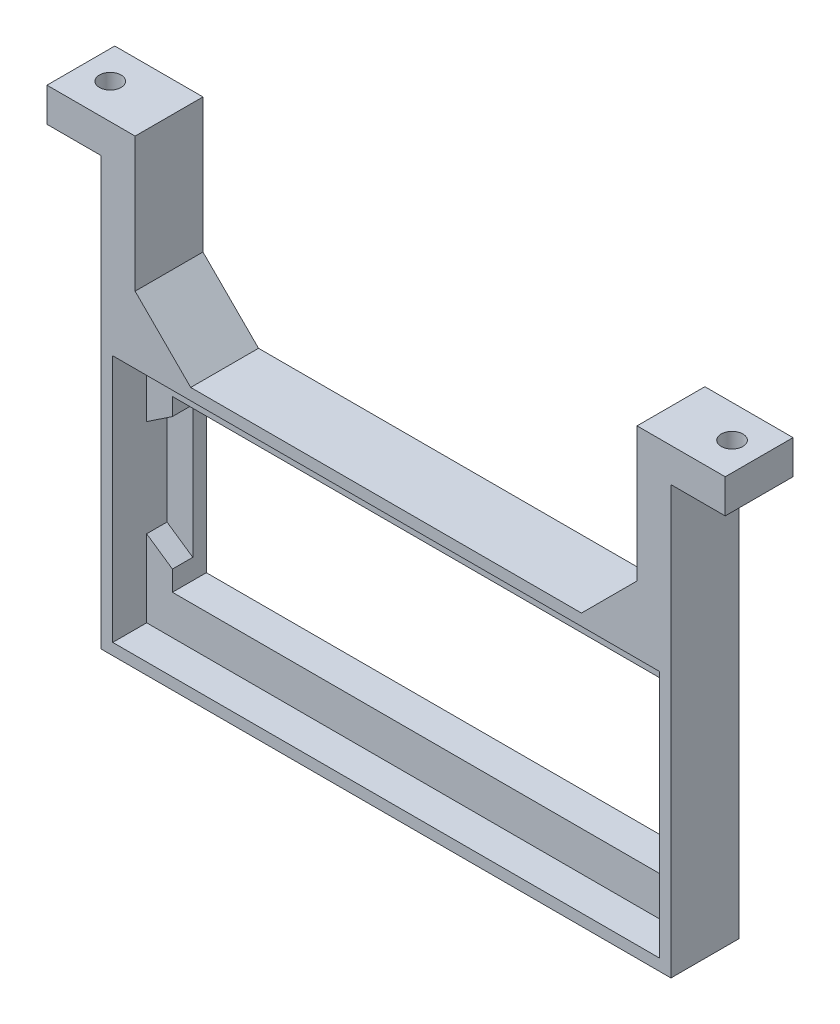
ISO-10303-21;
HEADER;
FILE_DESCRIPTION(('STEP AP214'),'2;1');
FILE_NAME('part.step','',(''),(''),'','','');
FILE_SCHEMA(('AUTOMOTIVE_DESIGN { 1 0 10303 214 1 1 1 1 }'));
ENDSEC;
DATA;
#1=APPLICATION_CONTEXT('core data for automotive mechanical design processes');
#2=APPLICATION_PROTOCOL_DEFINITION('international standard','automotive_design',2000,#1);
#3=PRODUCT_CONTEXT('',#1,'mechanical');
#4=PRODUCT('Part','Part','',(#3));
#5=PRODUCT_RELATED_PRODUCT_CATEGORY('part','',(#4));
#6=PRODUCT_DEFINITION_FORMATION('','',#4);
#7=PRODUCT_DEFINITION_CONTEXT('part definition',#1,'design');
#8=PRODUCT_DEFINITION('design','',#6,#7);
#9=PRODUCT_DEFINITION_SHAPE('','',#8);
#10=(LENGTH_UNIT() NAMED_UNIT(*) SI_UNIT(.MILLI.,.METRE.));
#11=(NAMED_UNIT(*) PLANE_ANGLE_UNIT() SI_UNIT($,.RADIAN.));
#12=(NAMED_UNIT(*) SI_UNIT($,.STERADIAN.) SOLID_ANGLE_UNIT());
#13=UNCERTAINTY_MEASURE_WITH_UNIT(LENGTH_MEASURE(1.E-05),#10,'distance_accuracy_value','');
#14=(GEOMETRIC_REPRESENTATION_CONTEXT(3) GLOBAL_UNCERTAINTY_ASSIGNED_CONTEXT((#13)) GLOBAL_UNIT_ASSIGNED_CONTEXT((#10,
#11,#12)) REPRESENTATION_CONTEXT('',''));
#15=CARTESIAN_POINT('',(0.,0.,0.));
#16=DIRECTION('',(0.,0.,1.));
#17=DIRECTION('',(1.,0.,0.));
#18=AXIS2_PLACEMENT_3D('',#15,#16,#17);
#19=CARTESIAN_POINT('',(0.,0.,5.));
#20=DIRECTION('',(0.,0.,1.));
#21=DIRECTION('',(1.,0.,0.));
#22=AXIS2_PLACEMENT_3D('',#19,#20,#21);
#23=PLANE('',#22);
#24=DIRECTION('',(0.824921634455723,-0.56524711145383,0.));
#25=VECTOR('',#24,1.);
#26=CARTESIAN_POINT('',(1.69999999999999,13.0683034309097,5.));
#27=LINE('',#26,#25);
#28=CARTESIAN_POINT('',(1.69999999999999,13.0683034309097,5.));
#29=VERTEX_POINT('',#28);
#30=CARTESIAN_POINT('',(5.49999999999999,10.4644936460666,5.));
#31=VERTEX_POINT('',#30);
#32=EDGE_CURVE('E257',#29,#31,#27,.T.);
#33=ORIENTED_EDGE('',*,*,#32,.F.);
#34=DIRECTION('',(0.,-1.,0.));
#35=VECTOR('',#34,1.);
#36=CARTESIAN_POINT('',(1.7,38.3,5.));
#37=LINE('',#36,#35);
#38=CARTESIAN_POINT('',(1.7,1.7,5.));
#39=VERTEX_POINT('',#38);
#40=EDGE_CURVE('E316',#29,#39,#37,.T.);
#41=ORIENTED_EDGE('',*,*,#40,.T.);
#42=DIRECTION('',(1.,0.,0.));
#43=VECTOR('',#42,1.);
#44=CARTESIAN_POINT('',(1.7,1.7,5.));
#45=LINE('',#44,#43);
#46=CARTESIAN_POINT('',(82.3,1.7,5.));
#47=VERTEX_POINT('',#46);
#48=EDGE_CURVE('E315',#39,#47,#45,.T.);
#49=ORIENTED_EDGE('',*,*,#48,.T.);
#50=DIRECTION('',(0.,1.,0.));
#51=VECTOR('',#50,1.);
#52=CARTESIAN_POINT('',(82.3,38.3,5.));
#53=LINE('',#52,#51);
#54=CARTESIAN_POINT('',(82.3,13.0683034309097,5.));
#55=VERTEX_POINT('',#54);
#56=EDGE_CURVE('E320',#47,#55,#53,.T.);
#57=ORIENTED_EDGE('',*,*,#56,.T.);
#58=DIRECTION('',(0.824921634455723,0.56524711145383,0.));
#59=VECTOR('',#58,1.);
#60=CARTESIAN_POINT('',(82.3,13.0683034309097,5.));
#61=LINE('',#60,#59);
#62=CARTESIAN_POINT('',(78.5,10.4644936460666,5.));
#63=VERTEX_POINT('',#62);
#64=EDGE_CURVE('E261',#63,#55,#61,.T.);
#65=ORIENTED_EDGE('',*,*,#64,.F.);
#66=DIRECTION('',(0.,1.,0.));
#67=VECTOR('',#66,1.);
#68=CARTESIAN_POINT('',(78.5,32.5,5.));
#69=LINE('',#68,#67);
#70=CARTESIAN_POINT('',(78.5,7.5,5.));
#71=VERTEX_POINT('',#70);
#72=EDGE_CURVE('E298',#71,#63,#69,.T.);
#73=ORIENTED_EDGE('',*,*,#72,.F.);
#74=DIRECTION('',(1.,0.,0.));
#75=VECTOR('',#74,1.);
#76=CARTESIAN_POINT('',(5.49999999999999,7.5,5.));
#77=LINE('',#76,#75);
#78=CARTESIAN_POINT('',(5.49999999999999,7.5,5.));
#79=VERTEX_POINT('',#78);
#80=EDGE_CURVE('E294',#79,#71,#77,.T.);
#81=ORIENTED_EDGE('',*,*,#80,.F.);
#82=DIRECTION('',(0.,-1.,0.));
#83=VECTOR('',#82,1.);
#84=CARTESIAN_POINT('',(5.49999999999999,32.5,5.));
#85=LINE('',#84,#83);
#86=EDGE_CURVE('E274',#31,#79,#85,.T.);
#87=ORIENTED_EDGE('',*,*,#86,.F.);
#88=EDGE_LOOP('',(#33,#41,#49,#57,#65,#73,#81,#87));
#89=FACE_BOUND('',#88,.T.);
#90=ADVANCED_FACE('F35',(#89),#23,.T.);
#91=CARTESIAN_POINT('',(0.,0.,10.));
#92=DIRECTION('',(0.,1.,0.));
#93=DIRECTION('',(0.,0.,1.));
#94=AXIS2_PLACEMENT_3D('',#91,#92,#93);
#95=PLANE('',#94);
#96=DIRECTION('',(1.,0.,0.));
#97=VECTOR('',#96,1.);
#98=CARTESIAN_POINT('',(0.,0.,0.));
#99=LINE('',#98,#97);
#100=CARTESIAN_POINT('',(0.,0.,0.));
#101=VERTEX_POINT('',#100);
#102=CARTESIAN_POINT('',(84.,0.,0.));
#103=VERTEX_POINT('',#102);
#104=EDGE_CURVE('E339',#101,#103,#99,.T.);
#105=ORIENTED_EDGE('',*,*,#104,.T.);
#106=DIRECTION('',(0.,0.,-1.));
#107=VECTOR('',#106,1.);
#108=CARTESIAN_POINT('',(84.,0.,10.));
#109=LINE('',#108,#107);
#110=CARTESIAN_POINT('',(84.,0.,10.));
#111=VERTEX_POINT('',#110);
#112=EDGE_CURVE('E440',#111,#103,#109,.T.);
#113=ORIENTED_EDGE('',*,*,#112,.F.);
#114=DIRECTION('',(1.,0.,0.));
#115=VECTOR('',#114,1.);
#116=CARTESIAN_POINT('',(0.,0.,10.));
#117=LINE('',#116,#115);
#118=CARTESIAN_POINT('',(0.,0.,10.));
#119=VERTEX_POINT('',#118);
#120=EDGE_CURVE('E349',#119,#111,#117,.T.);
#121=ORIENTED_EDGE('',*,*,#120,.F.);
#122=DIRECTION('',(0.,0.,-1.));
#123=VECTOR('',#122,1.);
#124=CARTESIAN_POINT('',(0.,0.,10.));
#125=LINE('',#124,#123);
#126=EDGE_CURVE('E443',#119,#101,#125,.T.);
#127=ORIENTED_EDGE('',*,*,#126,.T.);
#128=EDGE_LOOP('',(#105,#113,#121,#127));
#129=FACE_BOUND('',#128,.T.);
#130=ADVANCED_FACE('F37',(#129),#95,.F.);
#131=CARTESIAN_POINT('',(84.,40.,10.));
#132=DIRECTION('',(-1.,0.,0.));
#133=DIRECTION('',(0.,-1.,0.));
#134=AXIS2_PLACEMENT_3D('',#131,#132,#133);
#135=PLANE('',#134);
#136=DIRECTION('',(0.,1.,0.));
#137=VECTOR('',#136,1.);
#138=CARTESIAN_POINT('',(84.,40.,0.));
#139=LINE('',#138,#137);
#140=CARTESIAN_POINT('',(84.,63.,0.));
#141=VERTEX_POINT('',#140);
#142=EDGE_CURVE('E380',#103,#141,#139,.T.);
#143=ORIENTED_EDGE('',*,*,#142,.T.);
#144=DIRECTION('',(0.,0.,-1.));
#145=VECTOR('',#144,1.);
#146=CARTESIAN_POINT('',(84.,63.,10.));
#147=LINE('',#146,#145);
#148=CARTESIAN_POINT('',(84.,63.,10.));
#149=VERTEX_POINT('',#148);
#150=EDGE_CURVE('E437',#149,#141,#147,.T.);
#151=ORIENTED_EDGE('',*,*,#150,.F.);
#152=DIRECTION('',(0.,1.,0.));
#153=VECTOR('',#152,1.);
#154=CARTESIAN_POINT('',(84.,0.,10.));
#155=LINE('',#154,#153);
#156=EDGE_CURVE('E352',#111,#149,#155,.T.);
#157=ORIENTED_EDGE('',*,*,#156,.F.);
#158=ORIENTED_EDGE('',*,*,#112,.T.);
#159=EDGE_LOOP('',(#143,#151,#157,#158));
#160=FACE_BOUND('',#159,.T.);
#161=ADVANCED_FACE('F525',(#160),#135,.F.);
#162=CARTESIAN_POINT('',(84.,63.,10.));
#163=DIRECTION('',(0.,1.,0.));
#164=DIRECTION('',(0.,0.,1.));
#165=AXIS2_PLACEMENT_3D('',#162,#163,#164);
#166=PLANE('',#165);
#167=CARTESIAN_POINT('',(87.8374504249292,63.,4.83087818696864));
#168=DIRECTION('',(0.,-1.,0.));
#169=DIRECTION('',(0.,0.,-1.));
#170=AXIS2_PLACEMENT_3D('',#167,#168,#169);
#171=CIRCLE('',#170,1.60000000000001);
#172=CARTESIAN_POINT('',(87.8374504249292,63.,3.23087818696863));
#173=VERTEX_POINT('',#172);
#174=EDGE_CURVE('E808',#173,#173,#171,.T.);
#175=ORIENTED_EDGE('',*,*,#174,.F.);
#176=EDGE_LOOP('',(#175));
#177=FACE_BOUND('',#176,.T.);
#178=DIRECTION('',(1.,0.,0.));
#179=VECTOR('',#178,1.);
#180=CARTESIAN_POINT('',(84.,63.,0.));
#181=LINE('',#180,#179);
#182=CARTESIAN_POINT('',(92.,63.,0.));
#183=VERTEX_POINT('',#182);
#184=EDGE_CURVE('E382',#141,#183,#181,.T.);
#185=ORIENTED_EDGE('',*,*,#184,.T.);
#186=DIRECTION('',(0.,0.,-1.));
#187=VECTOR('',#186,1.);
#188=CARTESIAN_POINT('',(92.,63.,10.));
#189=LINE('',#188,#187);
#190=CARTESIAN_POINT('',(92.,63.,10.));
#191=VERTEX_POINT('',#190);
#192=EDGE_CURVE('E434',#191,#183,#189,.T.);
#193=ORIENTED_EDGE('',*,*,#192,.F.);
#194=DIRECTION('',(1.,0.,0.));
#195=VECTOR('',#194,1.);
#196=CARTESIAN_POINT('',(84.,63.,10.));
#197=LINE('',#196,#195);
#198=EDGE_CURVE('E354',#149,#191,#197,.T.);
#199=ORIENTED_EDGE('',*,*,#198,.F.);
#200=ORIENTED_EDGE('',*,*,#150,.T.);
#201=EDGE_LOOP('',(#185,#193,#199,#200));
#202=FACE_BOUND('',#201,.T.);
#203=ADVANCED_FACE('F589',(#177,#202),#166,.F.);
#204=CARTESIAN_POINT('',(92.,63.,10.));
#205=DIRECTION('',(-1.,0.,0.));
#206=DIRECTION('',(0.,0.,1.));
#207=AXIS2_PLACEMENT_3D('',#204,#205,#206);
#208=PLANE('',#207);
#209=DIRECTION('',(0.,1.,0.));
#210=VECTOR('',#209,1.);
#211=CARTESIAN_POINT('',(92.,63.,0.));
#212=LINE('',#211,#210);
#213=CARTESIAN_POINT('',(92.,68.,0.));
#214=VERTEX_POINT('',#213);
#215=EDGE_CURVE('E384',#183,#214,#212,.T.);
#216=ORIENTED_EDGE('',*,*,#215,.T.);
#217=DIRECTION('',(0.,0.,-1.));
#218=VECTOR('',#217,1.);
#219=CARTESIAN_POINT('',(92.,68.,10.));
#220=LINE('',#219,#218);
#221=CARTESIAN_POINT('',(92.,68.,10.));
#222=VERTEX_POINT('',#221);
#223=EDGE_CURVE('E431',#222,#214,#220,.T.);
#224=ORIENTED_EDGE('',*,*,#223,.F.);
#225=DIRECTION('',(0.,1.,0.));
#226=VECTOR('',#225,1.);
#227=CARTESIAN_POINT('',(92.,63.,10.));
#228=LINE('',#227,#226);
#229=EDGE_CURVE('E356',#191,#222,#228,.T.);
#230=ORIENTED_EDGE('',*,*,#229,.F.);
#231=ORIENTED_EDGE('',*,*,#192,.T.);
#232=EDGE_LOOP('',(#216,#224,#230,#231));
#233=FACE_BOUND('',#232,.T.);
#234=ADVANCED_FACE('F585',(#233),#208,.F.);
#235=CARTESIAN_POINT('',(92.,68.,10.));
#236=DIRECTION('',(0.,-1.,0.));
#237=DIRECTION('',(0.,0.,-1.));
#238=AXIS2_PLACEMENT_3D('',#235,#236,#237);
#239=PLANE('',#238);
#240=CARTESIAN_POINT('',(87.8374504249292,68.,4.83087818696864));
#241=DIRECTION('',(0.,-1.,0.));
#242=DIRECTION('',(0.,0.,-1.));
#243=AXIS2_PLACEMENT_3D('',#240,#241,#242);
#244=CIRCLE('',#243,1.60000000000001);
#245=CARTESIAN_POINT('',(87.8374504249292,68.,3.23087818696863));
#246=VERTEX_POINT('',#245);
#247=EDGE_CURVE('E259',#246,#246,#244,.T.);
#248=ORIENTED_EDGE('',*,*,#247,.T.);
#249=EDGE_LOOP('',(#248));
#250=FACE_BOUND('',#249,.T.);
#251=DIRECTION('',(-1.,0.,0.));
#252=VECTOR('',#251,1.);
#253=CARTESIAN_POINT('',(92.,68.,0.));
#254=LINE('',#253,#252);
#255=CARTESIAN_POINT('',(79.,68.,0.));
#256=VERTEX_POINT('',#255);
#257=EDGE_CURVE('E386',#214,#256,#254,.T.);
#258=ORIENTED_EDGE('',*,*,#257,.T.);
#259=DIRECTION('',(0.,0.,-1.));
#260=VECTOR('',#259,1.);
#261=CARTESIAN_POINT('',(79.,68.,10.));
#262=LINE('',#261,#260);
#263=CARTESIAN_POINT('',(79.,68.,10.));
#264=VERTEX_POINT('',#263);
#265=EDGE_CURVE('E428',#264,#256,#262,.T.);
#266=ORIENTED_EDGE('',*,*,#265,.F.);
#267=DIRECTION('',(-1.,0.,0.));
#268=VECTOR('',#267,1.);
#269=CARTESIAN_POINT('',(92.,68.,10.));
#270=LINE('',#269,#268);
#271=EDGE_CURVE('E358',#222,#264,#270,.T.);
#272=ORIENTED_EDGE('',*,*,#271,.F.);
#273=ORIENTED_EDGE('',*,*,#223,.T.);
#274=EDGE_LOOP('',(#258,#266,#272,#273));
#275=FACE_BOUND('',#274,.T.);
#276=ADVANCED_FACE('F581',(#250,#275),#239,.F.);
#277=CARTESIAN_POINT('',(79.,68.,10.));
#278=DIRECTION('',(1.,0.,0.));
#279=DIRECTION('',(0.,0.,-1.));
#280=AXIS2_PLACEMENT_3D('',#277,#278,#279);
#281=PLANE('',#280);
#282=DIRECTION('',(0.,-1.,0.));
#283=VECTOR('',#282,1.);
#284=CARTESIAN_POINT('',(79.,68.,0.));
#285=LINE('',#284,#283);
#286=CARTESIAN_POINT('',(79.,48.194055440136,0.));
#287=VERTEX_POINT('',#286);
#288=EDGE_CURVE('E388',#256,#287,#285,.T.);
#289=ORIENTED_EDGE('',*,*,#288,.T.);
#290=DIRECTION('',(0.,0.,-1.));
#291=VECTOR('',#290,1.);
#292=CARTESIAN_POINT('',(79.,48.194055440136,10.));
#293=LINE('',#292,#291);
#294=CARTESIAN_POINT('',(79.,48.194055440136,10.));
#295=VERTEX_POINT('',#294);
#296=EDGE_CURVE('E425',#295,#287,#293,.T.);
#297=ORIENTED_EDGE('',*,*,#296,.F.);
#298=DIRECTION('',(0.,-1.,0.));
#299=VECTOR('',#298,1.);
#300=CARTESIAN_POINT('',(79.,68.,10.));
#301=LINE('',#300,#299);
#302=EDGE_CURVE('E360',#264,#295,#301,.T.);
#303=ORIENTED_EDGE('',*,*,#302,.F.);
#304=ORIENTED_EDGE('',*,*,#265,.T.);
#305=EDGE_LOOP('',(#289,#297,#303,#304));
#306=FACE_BOUND('',#305,.T.);
#307=ADVANCED_FACE('F577',(#306),#281,.F.);
#308=CARTESIAN_POINT('',(79.,48.194055440136,10.));
#309=DIRECTION('',(0.707106781186539,-0.707106781186556,0.));
#310=DIRECTION('',(0.707106781186556,0.707106781186539,0.));
#311=AXIS2_PLACEMENT_3D('',#308,#309,#310);
#312=PLANE('',#311);
#313=DIRECTION('',(-0.707106781186556,-0.707106781186539,0.));
#314=VECTOR('',#313,1.);
#315=CARTESIAN_POINT('',(79.,48.194055440136,0.));
#316=LINE('',#315,#314);
#317=CARTESIAN_POINT('',(70.8059445598638,40.,0.));
#318=VERTEX_POINT('',#317);
#319=EDGE_CURVE('E390',#287,#318,#316,.T.);
#320=ORIENTED_EDGE('',*,*,#319,.T.);
#321=DIRECTION('',(0.,0.,-1.));
#322=VECTOR('',#321,1.);
#323=CARTESIAN_POINT('',(70.8059445598638,40.,10.));
#324=LINE('',#323,#322);
#325=CARTESIAN_POINT('',(70.8059445598638,40.,10.));
#326=VERTEX_POINT('',#325);
#327=EDGE_CURVE('E422',#326,#318,#324,.T.);
#328=ORIENTED_EDGE('',*,*,#327,.F.);
#329=DIRECTION('',(-0.707106781186556,-0.707106781186539,0.));
#330=VECTOR('',#329,1.);
#331=CARTESIAN_POINT('',(79.,48.194055440136,10.));
#332=LINE('',#331,#330);
#333=EDGE_CURVE('E362',#295,#326,#332,.T.);
#334=ORIENTED_EDGE('',*,*,#333,.F.);
#335=ORIENTED_EDGE('',*,*,#296,.T.);
#336=EDGE_LOOP('',(#320,#328,#334,#335));
#337=FACE_BOUND('',#336,.T.);
#338=ADVANCED_FACE('F573',(#337),#312,.F.);
#339=CARTESIAN_POINT('',(13.1940554401362,40.,10.));
#340=DIRECTION('',(0.,-1.,0.));
#341=DIRECTION('',(0.,0.,-1.));
#342=AXIS2_PLACEMENT_3D('',#339,#340,#341);
#343=PLANE('',#342);
#344=DIRECTION('',(-1.,0.,0.));
#345=VECTOR('',#344,1.);
#346=CARTESIAN_POINT('',(13.1940554401362,40.,0.));
#347=LINE('',#346,#345);
#348=CARTESIAN_POINT('',(13.1940554401362,40.,0.));
#349=VERTEX_POINT('',#348);
#350=EDGE_CURVE('E392',#318,#349,#347,.T.);
#351=ORIENTED_EDGE('',*,*,#350,.T.);
#352=DIRECTION('',(0.,0.,-1.));
#353=VECTOR('',#352,1.);
#354=CARTESIAN_POINT('',(13.1940554401362,40.,10.));
#355=LINE('',#354,#353);
#356=CARTESIAN_POINT('',(13.1940554401362,40.,10.));
#357=VERTEX_POINT('',#356);
#358=EDGE_CURVE('E419',#357,#349,#355,.T.);
#359=ORIENTED_EDGE('',*,*,#358,.F.);
#360=DIRECTION('',(-1.,0.,0.));
#361=VECTOR('',#360,1.);
#362=CARTESIAN_POINT('',(13.1940554401362,40.,10.));
#363=LINE('',#362,#361);
#364=EDGE_CURVE('E364',#326,#357,#363,.T.);
#365=ORIENTED_EDGE('',*,*,#364,.F.);
#366=ORIENTED_EDGE('',*,*,#327,.T.);
#367=EDGE_LOOP('',(#351,#359,#365,#366));
#368=FACE_BOUND('',#367,.T.);
#369=ADVANCED_FACE('F569',(#368),#343,.F.);
#370=CARTESIAN_POINT('',(5.,48.194055440136,10.));
#371=DIRECTION('',(-0.707106781186539,-0.707106781186556,0.));
#372=DIRECTION('',(0.707106781186556,-0.707106781186539,0.));
#373=AXIS2_PLACEMENT_3D('',#370,#371,#372);
#374=PLANE('',#373);
#375=DIRECTION('',(-0.707106781186556,0.707106781186539,0.));
#376=VECTOR('',#375,1.);
#377=CARTESIAN_POINT('',(5.,48.194055440136,0.));
#378=LINE('',#377,#376);
#379=CARTESIAN_POINT('',(5.,48.194055440136,0.));
#380=VERTEX_POINT('',#379);
#381=EDGE_CURVE('E394',#349,#380,#378,.T.);
#382=ORIENTED_EDGE('',*,*,#381,.T.);
#383=DIRECTION('',(0.,0.,-1.));
#384=VECTOR('',#383,1.);
#385=CARTESIAN_POINT('',(5.,48.194055440136,10.));
#386=LINE('',#385,#384);
#387=CARTESIAN_POINT('',(5.,48.194055440136,10.));
#388=VERTEX_POINT('',#387);
#389=EDGE_CURVE('E416',#388,#380,#386,.T.);
#390=ORIENTED_EDGE('',*,*,#389,.F.);
#391=DIRECTION('',(-0.707106781186556,0.707106781186539,0.));
#392=VECTOR('',#391,1.);
#393=CARTESIAN_POINT('',(5.,48.194055440136,10.));
#394=LINE('',#393,#392);
#395=EDGE_CURVE('E366',#357,#388,#394,.T.);
#396=ORIENTED_EDGE('',*,*,#395,.F.);
#397=ORIENTED_EDGE('',*,*,#358,.T.);
#398=EDGE_LOOP('',(#382,#390,#396,#397));
#399=FACE_BOUND('',#398,.T.);
#400=ADVANCED_FACE('F565',(#399),#374,.F.);
#401=CARTESIAN_POINT('',(5.,68.,10.));
#402=DIRECTION('',(-1.,0.,0.));
#403=DIRECTION('',(0.,-1.,0.));
#404=AXIS2_PLACEMENT_3D('',#401,#402,#403);
#405=PLANE('',#404);
#406=DIRECTION('',(0.,1.,0.));
#407=VECTOR('',#406,1.);
#408=CARTESIAN_POINT('',(5.,68.,0.));
#409=LINE('',#408,#407);
#410=CARTESIAN_POINT('',(5.,68.,0.));
#411=VERTEX_POINT('',#410);
#412=EDGE_CURVE('E396',#380,#411,#409,.T.);
#413=ORIENTED_EDGE('',*,*,#412,.T.);
#414=DIRECTION('',(0.,0.,-1.));
#415=VECTOR('',#414,1.);
#416=CARTESIAN_POINT('',(5.,68.,10.));
#417=LINE('',#416,#415);
#418=CARTESIAN_POINT('',(5.,68.,10.));
#419=VERTEX_POINT('',#418);
#420=EDGE_CURVE('E413',#419,#411,#417,.T.);
#421=ORIENTED_EDGE('',*,*,#420,.F.);
#422=DIRECTION('',(0.,1.,0.));
#423=VECTOR('',#422,1.);
#424=CARTESIAN_POINT('',(5.,68.,10.));
#425=LINE('',#424,#423);
#426=EDGE_CURVE('E368',#388,#419,#425,.T.);
#427=ORIENTED_EDGE('',*,*,#426,.F.);
#428=ORIENTED_EDGE('',*,*,#389,.T.);
#429=EDGE_LOOP('',(#413,#421,#427,#428));
#430=FACE_BOUND('',#429,.T.);
#431=ADVANCED_FACE('F561',(#430),#405,.F.);
#432=CARTESIAN_POINT('',(-8.,68.,10.));
#433=DIRECTION('',(0.,-1.,0.));
#434=DIRECTION('',(0.,0.,-1.));
#435=AXIS2_PLACEMENT_3D('',#432,#433,#434);
#436=PLANE('',#435);
#437=CARTESIAN_POINT('',(-3.83745042492921,68.,4.83087818696864));
#438=DIRECTION('',(0.,-1.,0.));
#439=DIRECTION('',(0.,0.,1.));
#440=AXIS2_PLACEMENT_3D('',#437,#438,#439);
#441=CIRCLE('',#440,1.60000000000001);
#442=CARTESIAN_POINT('',(-3.83745042492921,68.,6.43087818696864));
#443=VERTEX_POINT('',#442);
#444=EDGE_CURVE('E803',#443,#443,#441,.T.);
#445=ORIENTED_EDGE('',*,*,#444,.T.);
#446=EDGE_LOOP('',(#445));
#447=FACE_BOUND('',#446,.T.);
#448=DIRECTION('',(-1.,0.,0.));
#449=VECTOR('',#448,1.);
#450=CARTESIAN_POINT('',(-8.,68.,0.));
#451=LINE('',#450,#449);
#452=CARTESIAN_POINT('',(-8.,68.,0.));
#453=VERTEX_POINT('',#452);
#454=EDGE_CURVE('E398',#411,#453,#451,.T.);
#455=ORIENTED_EDGE('',*,*,#454,.T.);
#456=DIRECTION('',(0.,0.,-1.));
#457=VECTOR('',#456,1.);
#458=CARTESIAN_POINT('',(-8.,68.,10.));
#459=LINE('',#458,#457);
#460=CARTESIAN_POINT('',(-8.,68.,10.));
#461=VERTEX_POINT('',#460);
#462=EDGE_CURVE('E410',#461,#453,#459,.T.);
#463=ORIENTED_EDGE('',*,*,#462,.F.);
#464=DIRECTION('',(-1.,0.,0.));
#465=VECTOR('',#464,1.);
#466=CARTESIAN_POINT('',(-8.,68.,10.));
#467=LINE('',#466,#465);
#468=EDGE_CURVE('E370',#419,#461,#467,.T.);
#469=ORIENTED_EDGE('',*,*,#468,.F.);
#470=ORIENTED_EDGE('',*,*,#420,.T.);
#471=EDGE_LOOP('',(#455,#463,#469,#470));
#472=FACE_BOUND('',#471,.T.);
#473=ADVANCED_FACE('F557',(#447,#472),#436,.F.);
#474=CARTESIAN_POINT('',(-8.,63.,10.));
#475=DIRECTION('',(1.,0.,0.));
#476=DIRECTION('',(0.,0.,-1.));
#477=AXIS2_PLACEMENT_3D('',#474,#475,#476);
#478=PLANE('',#477);
#479=DIRECTION('',(0.,-1.,0.));
#480=VECTOR('',#479,1.);
#481=CARTESIAN_POINT('',(-8.,63.,0.));
#482=LINE('',#481,#480);
#483=CARTESIAN_POINT('',(-8.,63.,0.));
#484=VERTEX_POINT('',#483);
#485=EDGE_CURVE('E400',#453,#484,#482,.T.);
#486=ORIENTED_EDGE('',*,*,#485,.T.);
#487=DIRECTION('',(0.,0.,-1.));
#488=VECTOR('',#487,1.);
#489=CARTESIAN_POINT('',(-8.,63.,10.));
#490=LINE('',#489,#488);
#491=CARTESIAN_POINT('',(-8.,63.,10.));
#492=VERTEX_POINT('',#491);
#493=EDGE_CURVE('E407',#492,#484,#490,.T.);
#494=ORIENTED_EDGE('',*,*,#493,.F.);
#495=DIRECTION('',(0.,-1.,0.));
#496=VECTOR('',#495,1.);
#497=CARTESIAN_POINT('',(-8.,63.,10.));
#498=LINE('',#497,#496);
#499=EDGE_CURVE('E372',#461,#492,#498,.T.);
#500=ORIENTED_EDGE('',*,*,#499,.F.);
#501=ORIENTED_EDGE('',*,*,#462,.T.);
#502=EDGE_LOOP('',(#486,#494,#500,#501));
#503=FACE_BOUND('',#502,.T.);
#504=ADVANCED_FACE('F553',(#503),#478,.F.);
#505=CARTESIAN_POINT('',(0.,63.,10.));
#506=DIRECTION('',(0.,1.,0.));
#507=DIRECTION('',(0.,0.,1.));
#508=AXIS2_PLACEMENT_3D('',#505,#506,#507);
#509=PLANE('',#508);
#510=CARTESIAN_POINT('',(-3.83745042492921,63.,4.83087818696864));
#511=DIRECTION('',(0.,-1.,0.));
#512=DIRECTION('',(0.,0.,1.));
#513=AXIS2_PLACEMENT_3D('',#510,#511,#512);
#514=CIRCLE('',#513,1.60000000000001);
#515=CARTESIAN_POINT('',(-3.83745042492921,63.,6.43087818696864));
#516=VERTEX_POINT('',#515);
#517=EDGE_CURVE('E806',#516,#516,#514,.T.);
#518=ORIENTED_EDGE('',*,*,#517,.F.);
#519=EDGE_LOOP('',(#518));
#520=FACE_BOUND('',#519,.T.);
#521=DIRECTION('',(1.,0.,0.));
#522=VECTOR('',#521,1.);
#523=CARTESIAN_POINT('',(0.,63.,0.));
#524=LINE('',#523,#522);
#525=CARTESIAN_POINT('',(0.,63.,0.));
#526=VERTEX_POINT('',#525);
#527=EDGE_CURVE('E402',#484,#526,#524,.T.);
#528=ORIENTED_EDGE('',*,*,#527,.T.);
#529=DIRECTION('',(0.,0.,-1.));
#530=VECTOR('',#529,1.);
#531=CARTESIAN_POINT('',(0.,63.,10.));
#532=LINE('',#531,#530);
#533=CARTESIAN_POINT('',(0.,63.,10.));
#534=VERTEX_POINT('',#533);
#535=EDGE_CURVE('E377',#534,#526,#532,.T.);
#536=ORIENTED_EDGE('',*,*,#535,.F.);
#537=DIRECTION('',(1.,0.,0.));
#538=VECTOR('',#537,1.);
#539=CARTESIAN_POINT('',(0.,63.,10.));
#540=LINE('',#539,#538);
#541=EDGE_CURVE('E374',#492,#534,#540,.T.);
#542=ORIENTED_EDGE('',*,*,#541,.F.);
#543=ORIENTED_EDGE('',*,*,#493,.T.);
#544=EDGE_LOOP('',(#528,#536,#542,#543));
#545=FACE_BOUND('',#544,.T.);
#546=ADVANCED_FACE('F549',(#520,#545),#509,.F.);
#547=CARTESIAN_POINT('',(0.,40.,10.));
#548=DIRECTION('',(1.,0.,0.));
#549=DIRECTION('',(0.,0.,-1.));
#550=AXIS2_PLACEMENT_3D('',#547,#548,#549);
#551=PLANE('',#550);
#552=DIRECTION('',(0.,-1.,0.));
#553=VECTOR('',#552,1.);
#554=CARTESIAN_POINT('',(0.,40.,0.));
#555=LINE('',#554,#553);
#556=EDGE_CURVE('E350',#526,#101,#555,.T.);
#557=ORIENTED_EDGE('',*,*,#556,.T.);
#558=ORIENTED_EDGE('',*,*,#126,.F.);
#559=DIRECTION('',(0.,-1.,0.));
#560=VECTOR('',#559,1.);
#561=CARTESIAN_POINT('',(0.,0.,10.));
#562=LINE('',#561,#560);
#563=EDGE_CURVE('E346',#534,#119,#562,.T.);
#564=ORIENTED_EDGE('',*,*,#563,.F.);
#565=ORIENTED_EDGE('',*,*,#535,.T.);
#566=EDGE_LOOP('',(#557,#558,#564,#565));
#567=FACE_BOUND('',#566,.T.);
#568=ADVANCED_FACE('F544',(#567),#551,.F.);
#569=CARTESIAN_POINT('',(0.,0.,10.));
#570=DIRECTION('',(0.,0.,1.));
#571=DIRECTION('',(1.,0.,0.));
#572=AXIS2_PLACEMENT_3D('',#569,#570,#571);
#573=PLANE('',#572);
#574=DIRECTION('',(0.,-1.,0.));
#575=VECTOR('',#574,1.);
#576=CARTESIAN_POINT('',(1.7,38.3,10.));
#577=LINE('',#576,#575);
#578=CARTESIAN_POINT('',(1.7,38.3,10.));
#579=VERTEX_POINT('',#578);
#580=CARTESIAN_POINT('',(1.7,1.7,10.));
#581=VERTEX_POINT('',#580);
#582=EDGE_CURVE('E305',#579,#581,#577,.T.);
#583=ORIENTED_EDGE('',*,*,#582,.F.);
#584=DIRECTION('',(-1.,0.,0.));
#585=VECTOR('',#584,1.);
#586=CARTESIAN_POINT('',(1.7,38.3,10.));
#587=LINE('',#586,#585);
#588=CARTESIAN_POINT('',(82.3,38.3,10.));
#589=VERTEX_POINT('',#588);
#590=EDGE_CURVE('E334',#589,#579,#587,.T.);
#591=ORIENTED_EDGE('',*,*,#590,.F.);
#592=DIRECTION('',(0.,1.,0.));
#593=VECTOR('',#592,1.);
#594=CARTESIAN_POINT('',(82.3,38.3,10.));
#595=LINE('',#594,#593);
#596=CARTESIAN_POINT('',(82.3,1.7,10.));
#597=VERTEX_POINT('',#596);
#598=EDGE_CURVE('E331',#597,#589,#595,.T.);
#599=ORIENTED_EDGE('',*,*,#598,.F.);
#600=DIRECTION('',(1.,0.,0.));
#601=VECTOR('',#600,1.);
#602=CARTESIAN_POINT('',(1.7,1.7,10.));
#603=LINE('',#602,#601);
#604=EDGE_CURVE('E328',#581,#597,#603,.T.);
#605=ORIENTED_EDGE('',*,*,#604,.F.);
#606=EDGE_LOOP('',(#583,#591,#599,#605));
#607=FACE_BOUND('',#606,.T.);
#608=ORIENTED_EDGE('',*,*,#563,.T.);
#609=ORIENTED_EDGE('',*,*,#120,.T.);
#610=ORIENTED_EDGE('',*,*,#156,.T.);
#611=ORIENTED_EDGE('',*,*,#198,.T.);
#612=ORIENTED_EDGE('',*,*,#229,.T.);
#613=ORIENTED_EDGE('',*,*,#271,.T.);
#614=ORIENTED_EDGE('',*,*,#302,.T.);
#615=ORIENTED_EDGE('',*,*,#333,.T.);
#616=ORIENTED_EDGE('',*,*,#364,.T.);
#617=ORIENTED_EDGE('',*,*,#395,.T.);
#618=ORIENTED_EDGE('',*,*,#426,.T.);
#619=ORIENTED_EDGE('',*,*,#468,.T.);
#620=ORIENTED_EDGE('',*,*,#499,.T.);
#621=ORIENTED_EDGE('',*,*,#541,.T.);
#622=EDGE_LOOP('',(#608,#609,#610,#611,#612,#613,#614,#615,#616,#617,#618,#619,#620,#621));
#623=FACE_BOUND('',#622,.T.);
#624=ADVANCED_FACE('F471',(#607,#623),#573,.T.);
#625=CARTESIAN_POINT('',(0.,0.,0.));
#626=DIRECTION('',(0.,0.,1.));
#627=DIRECTION('',(1.,0.,0.));
#628=AXIS2_PLACEMENT_3D('',#625,#626,#627);
#629=PLANE('',#628);
#630=DIRECTION('',(-1.,0.,0.));
#631=VECTOR('',#630,1.);
#632=CARTESIAN_POINT('',(5.49999999999999,32.5,0.));
#633=LINE('',#632,#631);
#634=CARTESIAN_POINT('',(78.5,32.5,0.));
#635=VERTEX_POINT('',#634);
#636=CARTESIAN_POINT('',(5.49999999999999,32.5,0.));
#637=VERTEX_POINT('',#636);
#638=EDGE_CURVE('E287',#635,#637,#633,.T.);
#639=ORIENTED_EDGE('',*,*,#638,.T.);
#640=DIRECTION('',(0.,-1.,0.));
#641=VECTOR('',#640,1.);
#642=CARTESIAN_POINT('',(5.49999999999999,32.5,0.));
#643=LINE('',#642,#641);
#644=CARTESIAN_POINT('',(5.49999999999999,7.5,0.));
#645=VERTEX_POINT('',#644);
#646=EDGE_CURVE('E277',#637,#645,#643,.T.);
#647=ORIENTED_EDGE('',*,*,#646,.T.);
#648=DIRECTION('',(1.,0.,0.));
#649=VECTOR('',#648,1.);
#650=CARTESIAN_POINT('',(5.49999999999999,7.5,0.));
#651=LINE('',#650,#649);
#652=CARTESIAN_POINT('',(78.5,7.5,0.));
#653=VERTEX_POINT('',#652);
#654=EDGE_CURVE('E280',#645,#653,#651,.T.);
#655=ORIENTED_EDGE('',*,*,#654,.T.);
#656=DIRECTION('',(0.,1.,0.));
#657=VECTOR('',#656,1.);
#658=CARTESIAN_POINT('',(78.5,32.5,0.));
#659=LINE('',#658,#657);
#660=EDGE_CURVE('E284',#653,#635,#659,.T.);
#661=ORIENTED_EDGE('',*,*,#660,.T.);
#662=EDGE_LOOP('',(#639,#647,#655,#661));
#663=FACE_BOUND('',#662,.T.);
#664=ORIENTED_EDGE('',*,*,#104,.F.);
#665=ORIENTED_EDGE('',*,*,#556,.F.);
#666=ORIENTED_EDGE('',*,*,#527,.F.);
#667=ORIENTED_EDGE('',*,*,#485,.F.);
#668=ORIENTED_EDGE('',*,*,#454,.F.);
#669=ORIENTED_EDGE('',*,*,#412,.F.);
#670=ORIENTED_EDGE('',*,*,#381,.F.);
#671=ORIENTED_EDGE('',*,*,#350,.F.);
#672=ORIENTED_EDGE('',*,*,#319,.F.);
#673=ORIENTED_EDGE('',*,*,#288,.F.);
#674=ORIENTED_EDGE('',*,*,#257,.F.);
#675=ORIENTED_EDGE('',*,*,#215,.F.);
#676=ORIENTED_EDGE('',*,*,#184,.F.);
#677=ORIENTED_EDGE('',*,*,#142,.F.);
#678=EDGE_LOOP('',(#664,#665,#666,#667,#668,#669,#670,#671,#672,#673,#674,#675,#676,#677));
#679=FACE_BOUND('',#678,.T.);
#680=ADVANCED_FACE('F493',(#663,#679),#629,.F.);
#681=CARTESIAN_POINT('',(1.7,38.3,5.));
#682=DIRECTION('',(-1.,0.,0.));
#683=DIRECTION('',(0.,-1.,0.));
#684=AXIS2_PLACEMENT_3D('',#681,#682,#683);
#685=PLANE('',#684);
#686=ORIENTED_EDGE('',*,*,#582,.T.);
#687=DIRECTION('',(0.,0.,1.));
#688=VECTOR('',#687,1.);
#689=CARTESIAN_POINT('',(1.7,1.7,5.));
#690=LINE('',#689,#688);
#691=EDGE_CURVE('E326',#39,#581,#690,.T.);
#692=ORIENTED_EDGE('',*,*,#691,.F.);
#693=ORIENTED_EDGE('',*,*,#40,.F.);
#694=DIRECTION('',(0.,0.,1.));
#695=VECTOR('',#694,1.);
#696=CARTESIAN_POINT('',(1.69999999999999,13.0683034309097,2.));
#697=LINE('',#696,#695);
#698=CARTESIAN_POINT('',(1.69999999999999,13.0683034309097,2.));
#699=VERTEX_POINT('',#698);
#700=EDGE_CURVE('E250',#699,#29,#697,.T.);
#701=ORIENTED_EDGE('',*,*,#700,.F.);
#702=DIRECTION('',(0.,-1.,0.));
#703=VECTOR('',#702,1.);
#704=CARTESIAN_POINT('',(1.69999999999999,27.3899905571294,2.));
#705=LINE('',#704,#703);
#706=CARTESIAN_POINT('',(1.69999999999999,27.3899905571294,2.));
#707=VERTEX_POINT('',#706);
#708=EDGE_CURVE('E236',#707,#699,#705,.T.);
#709=ORIENTED_EDGE('',*,*,#708,.F.);
#710=DIRECTION('',(0.,0.,1.));
#711=VECTOR('',#710,1.);
#712=CARTESIAN_POINT('',(1.69999999999999,27.3899905571294,2.));
#713=LINE('',#712,#711);
#714=CARTESIAN_POINT('',(1.69999999999999,27.3899905571294,5.));
#715=VERTEX_POINT('',#714);
#716=EDGE_CURVE('E243',#707,#715,#713,.T.);
#717=ORIENTED_EDGE('',*,*,#716,.T.);
#718=CARTESIAN_POINT('',(1.7,38.3,5.));
#719=VERTEX_POINT('',#718);
#720=EDGE_CURVE('E313',#719,#715,#37,.T.);
#721=ORIENTED_EDGE('',*,*,#720,.F.);
#722=DIRECTION('',(0.,0.,1.));
#723=VECTOR('',#722,1.);
#724=CARTESIAN_POINT('',(1.7,38.3,5.));
#725=LINE('',#724,#723);
#726=EDGE_CURVE('E337',#719,#579,#725,.T.);
#727=ORIENTED_EDGE('',*,*,#726,.T.);
#728=EDGE_LOOP('',(#686,#692,#693,#701,#709,#717,#721,#727));
#729=FACE_BOUND('',#728,.T.);
#730=ADVANCED_FACE('F252',(#729),#685,.F.);
#731=CARTESIAN_POINT('',(1.7,38.3,5.));
#732=DIRECTION('',(0.,1.,0.));
#733=DIRECTION('',(0.,0.,1.));
#734=AXIS2_PLACEMENT_3D('',#731,#732,#733);
#735=PLANE('',#734);
#736=ORIENTED_EDGE('',*,*,#590,.T.);
#737=ORIENTED_EDGE('',*,*,#726,.F.);
#738=DIRECTION('',(-1.,0.,0.));
#739=VECTOR('',#738,1.);
#740=CARTESIAN_POINT('',(1.7,38.3,5.));
#741=LINE('',#740,#739);
#742=CARTESIAN_POINT('',(82.3,38.3,5.));
#743=VERTEX_POINT('',#742);
#744=EDGE_CURVE('E323',#743,#719,#741,.T.);
#745=ORIENTED_EDGE('',*,*,#744,.F.);
#746=DIRECTION('',(0.,0.,1.));
#747=VECTOR('',#746,1.);
#748=CARTESIAN_POINT('',(82.3,38.3,5.));
#749=LINE('',#748,#747);
#750=EDGE_CURVE('E340',#743,#589,#749,.T.);
#751=ORIENTED_EDGE('',*,*,#750,.T.);
#752=EDGE_LOOP('',(#736,#737,#745,#751));
#753=FACE_BOUND('',#752,.T.);
#754=ADVANCED_FACE('F466',(#753),#735,.F.);
#755=CARTESIAN_POINT('',(82.3,38.3,5.));
#756=DIRECTION('',(1.,0.,0.));
#757=DIRECTION('',(0.,0.,-1.));
#758=AXIS2_PLACEMENT_3D('',#755,#756,#757);
#759=PLANE('',#758);
#760=ORIENTED_EDGE('',*,*,#598,.T.);
#761=ORIENTED_EDGE('',*,*,#750,.F.);
#762=CARTESIAN_POINT('',(82.3,27.3899905571294,5.));
#763=VERTEX_POINT('',#762);
#764=EDGE_CURVE('E319',#763,#743,#53,.T.);
#765=ORIENTED_EDGE('',*,*,#764,.F.);
#766=DIRECTION('',(0.,0.,1.));
#767=VECTOR('',#766,1.);
#768=CARTESIAN_POINT('',(82.3,27.3899905571294,2.));
#769=LINE('',#768,#767);
#770=CARTESIAN_POINT('',(82.3,27.3899905571294,2.));
#771=VERTEX_POINT('',#770);
#772=EDGE_CURVE('E272',#771,#763,#769,.T.);
#773=ORIENTED_EDGE('',*,*,#772,.F.);
#774=DIRECTION('',(0.,1.,0.));
#775=VECTOR('',#774,1.);
#776=CARTESIAN_POINT('',(82.3,27.3899905571294,2.));
#777=LINE('',#776,#775);
#778=CARTESIAN_POINT('',(82.3,13.0683034309097,2.));
#779=VERTEX_POINT('',#778);
#780=EDGE_CURVE('E265',#779,#771,#777,.T.);
#781=ORIENTED_EDGE('',*,*,#780,.F.);
#782=DIRECTION('',(0.,0.,1.));
#783=VECTOR('',#782,1.);
#784=CARTESIAN_POINT('',(82.3,13.0683034309097,2.));
#785=LINE('',#784,#783);
#786=EDGE_CURVE('E269',#779,#55,#785,.T.);
#787=ORIENTED_EDGE('',*,*,#786,.T.);
#788=ORIENTED_EDGE('',*,*,#56,.F.);
#789=DIRECTION('',(0.,0.,1.));
#790=VECTOR('',#789,1.);
#791=CARTESIAN_POINT('',(82.3,1.7,5.));
#792=LINE('',#791,#790);
#793=EDGE_CURVE('E342',#47,#597,#792,.T.);
#794=ORIENTED_EDGE('',*,*,#793,.T.);
#795=EDGE_LOOP('',(#760,#761,#765,#773,#781,#787,#788,#794));
#796=FACE_BOUND('',#795,.T.);
#797=ADVANCED_FACE('F505',(#796),#759,.F.);
#798=CARTESIAN_POINT('',(1.7,1.7,5.));
#799=DIRECTION('',(0.,-1.,0.));
#800=DIRECTION('',(0.,0.,-1.));
#801=AXIS2_PLACEMENT_3D('',#798,#799,#800);
#802=PLANE('',#801);
#803=ORIENTED_EDGE('',*,*,#604,.T.);
#804=ORIENTED_EDGE('',*,*,#793,.F.);
#805=ORIENTED_EDGE('',*,*,#48,.F.);
#806=ORIENTED_EDGE('',*,*,#691,.T.);
#807=EDGE_LOOP('',(#803,#804,#805,#806));
#808=FACE_BOUND('',#807,.T.);
#809=ADVANCED_FACE('F474',(#808),#802,.F.);
#810=DIRECTION('',(-0.830648132694788,-0.556797700830976,0.));
#811=VECTOR('',#810,1.);
#812=CARTESIAN_POINT('',(6.98268807050677,30.9310670443815,5.));
#813=LINE('',#812,#811);
#814=CARTESIAN_POINT('',(5.49999999999999,29.9371957814324,5.));
#815=VERTEX_POINT('',#814);
#816=EDGE_CURVE('E246',#815,#715,#813,.T.);
#817=ORIENTED_EDGE('',*,*,#816,.F.);
#818=CARTESIAN_POINT('',(5.49999999999999,32.5,5.));
#819=VERTEX_POINT('',#818);
#820=EDGE_CURVE('E291',#819,#815,#85,.T.);
#821=ORIENTED_EDGE('',*,*,#820,.F.);
#822=DIRECTION('',(-1.,0.,0.));
#823=VECTOR('',#822,1.);
#824=CARTESIAN_POINT('',(5.49999999999999,32.5,5.));
#825=LINE('',#824,#823);
#826=CARTESIAN_POINT('',(78.5,32.5,5.));
#827=VERTEX_POINT('',#826);
#828=EDGE_CURVE('E281',#827,#819,#825,.T.);
#829=ORIENTED_EDGE('',*,*,#828,.F.);
#830=CARTESIAN_POINT('',(78.5,29.9371957814324,5.));
#831=VERTEX_POINT('',#830);
#832=EDGE_CURVE('E297',#831,#827,#69,.T.);
#833=ORIENTED_EDGE('',*,*,#832,.F.);
#834=DIRECTION('',(-0.830648132694788,0.556797700830976,0.));
#835=VECTOR('',#834,1.);
#836=CARTESIAN_POINT('',(77.0173119294932,30.9310670443815,5.));
#837=LINE('',#836,#835);
#838=EDGE_CURVE('E266',#763,#831,#837,.T.);
#839=ORIENTED_EDGE('',*,*,#838,.F.);
#840=ORIENTED_EDGE('',*,*,#764,.T.);
#841=ORIENTED_EDGE('',*,*,#744,.T.);
#842=ORIENTED_EDGE('',*,*,#720,.T.);
#843=EDGE_LOOP('',(#817,#821,#829,#833,#839,#840,#841,#842));
#844=FACE_BOUND('',#843,.T.);
#845=ADVANCED_FACE('F459',(#844),#23,.T.);
#846=CARTESIAN_POINT('',(5.49999999999999,32.5,0.));
#847=DIRECTION('',(-1.,0.,0.));
#848=DIRECTION('',(0.,0.,1.));
#849=AXIS2_PLACEMENT_3D('',#846,#847,#848);
#850=PLANE('',#849);
#851=DIRECTION('',(0.,-1.,0.));
#852=VECTOR('',#851,1.);
#853=CARTESIAN_POINT('',(5.49999999999999,32.5,2.));
#854=LINE('',#853,#852);
#855=CARTESIAN_POINT('',(5.49999999999999,29.9371957814324,2.));
#856=VERTEX_POINT('',#855);
#857=CARTESIAN_POINT('',(5.49999999999999,10.4644936460666,2.));
#858=VERTEX_POINT('',#857);
#859=EDGE_CURVE('E238',#856,#858,#854,.T.);
#860=ORIENTED_EDGE('',*,*,#859,.T.);
#861=DIRECTION('',(0.,0.,1.));
#862=VECTOR('',#861,1.);
#863=CARTESIAN_POINT('',(5.49999999999999,10.4644936460666,0.));
#864=LINE('',#863,#862);
#865=EDGE_CURVE('E11',#858,#31,#864,.T.);
#866=ORIENTED_EDGE('',*,*,#865,.T.);
#867=ORIENTED_EDGE('',*,*,#86,.T.);
#868=DIRECTION('',(0.,0.,1.));
#869=VECTOR('',#868,1.);
#870=CARTESIAN_POINT('',(5.49999999999999,7.5,0.));
#871=LINE('',#870,#869);
#872=EDGE_CURVE('E290',#645,#79,#871,.T.);
#873=ORIENTED_EDGE('',*,*,#872,.F.);
#874=ORIENTED_EDGE('',*,*,#646,.F.);
#875=DIRECTION('',(0.,0.,1.));
#876=VECTOR('',#875,1.);
#877=CARTESIAN_POINT('',(5.49999999999999,32.5,0.));
#878=LINE('',#877,#876);
#879=EDGE_CURVE('E303',#637,#819,#878,.T.);
#880=ORIENTED_EDGE('',*,*,#879,.T.);
#881=ORIENTED_EDGE('',*,*,#820,.T.);
#882=DIRECTION('',(0.,0.,-1.));
#883=VECTOR('',#882,1.);
#884=CARTESIAN_POINT('',(5.49999999999999,29.9371957814324,0.));
#885=LINE('',#884,#883);
#886=EDGE_CURVE('E43',#815,#856,#885,.T.);
#887=ORIENTED_EDGE('',*,*,#886,.T.);
#888=EDGE_LOOP('',(#860,#866,#867,#873,#874,#880,#881,#887));
#889=FACE_BOUND('',#888,.T.);
#890=ADVANCED_FACE('F456',(#889),#850,.F.);
#891=CARTESIAN_POINT('',(5.49999999999999,32.5,0.));
#892=DIRECTION('',(0.,1.,0.));
#893=DIRECTION('',(0.,0.,1.));
#894=AXIS2_PLACEMENT_3D('',#891,#892,#893);
#895=PLANE('',#894);
#896=ORIENTED_EDGE('',*,*,#828,.T.);
#897=ORIENTED_EDGE('',*,*,#879,.F.);
#898=ORIENTED_EDGE('',*,*,#638,.F.);
#899=DIRECTION('',(0.,0.,1.));
#900=VECTOR('',#899,1.);
#901=CARTESIAN_POINT('',(78.5,32.5,0.));
#902=LINE('',#901,#900);
#903=EDGE_CURVE('E306',#635,#827,#902,.T.);
#904=ORIENTED_EDGE('',*,*,#903,.T.);
#905=EDGE_LOOP('',(#896,#897,#898,#904));
#906=FACE_BOUND('',#905,.T.);
#907=ADVANCED_FACE('F497',(#906),#895,.F.);
#908=CARTESIAN_POINT('',(78.5,32.5,0.));
#909=DIRECTION('',(1.,0.,0.));
#910=DIRECTION('',(0.,0.,-1.));
#911=AXIS2_PLACEMENT_3D('',#908,#909,#910);
#912=PLANE('',#911);
#913=DIRECTION('',(0.,1.,0.));
#914=VECTOR('',#913,1.);
#915=CARTESIAN_POINT('',(78.5,32.5,2.));
#916=LINE('',#915,#914);
#917=CARTESIAN_POINT('',(78.5,10.4644936460666,2.));
#918=VERTEX_POINT('',#917);
#919=CARTESIAN_POINT('',(78.5,29.9371957814324,2.));
#920=VERTEX_POINT('',#919);
#921=EDGE_CURVE('E446',#918,#920,#916,.T.);
#922=ORIENTED_EDGE('',*,*,#921,.T.);
#923=DIRECTION('',(0.,0.,1.));
#924=VECTOR('',#923,1.);
#925=CARTESIAN_POINT('',(78.5,29.9371957814324,0.));
#926=LINE('',#925,#924);
#927=EDGE_CURVE('E452',#920,#831,#926,.T.);
#928=ORIENTED_EDGE('',*,*,#927,.T.);
#929=ORIENTED_EDGE('',*,*,#832,.T.);
#930=ORIENTED_EDGE('',*,*,#903,.F.);
#931=ORIENTED_EDGE('',*,*,#660,.F.);
#932=DIRECTION('',(0.,0.,1.));
#933=VECTOR('',#932,1.);
#934=CARTESIAN_POINT('',(78.5,7.5,0.));
#935=LINE('',#934,#933);
#936=EDGE_CURVE('E309',#653,#71,#935,.T.);
#937=ORIENTED_EDGE('',*,*,#936,.T.);
#938=ORIENTED_EDGE('',*,*,#72,.T.);
#939=DIRECTION('',(0.,0.,-1.));
#940=VECTOR('',#939,1.);
#941=CARTESIAN_POINT('',(78.5,10.4644936460666,0.));
#942=LINE('',#941,#940);
#943=EDGE_CURVE('E449',#63,#918,#942,.T.);
#944=ORIENTED_EDGE('',*,*,#943,.T.);
#945=EDGE_LOOP('',(#922,#928,#929,#930,#931,#937,#938,#944));
#946=FACE_BOUND('',#945,.T.);
#947=ADVANCED_FACE('F491',(#946),#912,.F.);
#948=CARTESIAN_POINT('',(5.49999999999999,7.5,0.));
#949=DIRECTION('',(0.,-1.,0.));
#950=DIRECTION('',(0.,0.,-1.));
#951=AXIS2_PLACEMENT_3D('',#948,#949,#950);
#952=PLANE('',#951);
#953=ORIENTED_EDGE('',*,*,#80,.T.);
#954=ORIENTED_EDGE('',*,*,#936,.F.);
#955=ORIENTED_EDGE('',*,*,#654,.F.);
#956=ORIENTED_EDGE('',*,*,#872,.T.);
#957=EDGE_LOOP('',(#953,#954,#955,#956));
#958=FACE_BOUND('',#957,.T.);
#959=ADVANCED_FACE('F486',(#958),#952,.F.);
#960=CARTESIAN_POINT('',(77.0173119294932,30.9310670443815,2.));
#961=DIRECTION('',(0.556797700830976,0.830648132694788,0.));
#962=DIRECTION('',(-0.830648132694789,0.556797700830976,0.));
#963=AXIS2_PLACEMENT_3D('',#960,#961,#962);
#964=PLANE('',#963);
#965=DIRECTION('',(-0.830648132694788,0.556797700830976,0.));
#966=VECTOR('',#965,1.);
#967=CARTESIAN_POINT('',(77.0173119294932,30.9310670443815,2.));
#968=LINE('',#967,#966);
#969=EDGE_CURVE('E58',#771,#920,#968,.T.);
#970=ORIENTED_EDGE('',*,*,#969,.F.);
#971=ORIENTED_EDGE('',*,*,#772,.T.);
#972=ORIENTED_EDGE('',*,*,#838,.T.);
#973=ORIENTED_EDGE('',*,*,#927,.F.);
#974=EDGE_LOOP('',(#970,#971,#972,#973));
#975=FACE_BOUND('',#974,.T.);
#976=ADVANCED_FACE('F502',(#975),#964,.F.);
#977=CARTESIAN_POINT('',(82.3,13.0683034309097,2.));
#978=DIRECTION('',(0.56524711145383,-0.824921634455723,0.));
#979=DIRECTION('',(0.824921634455723,0.56524711145383,0.));
#980=AXIS2_PLACEMENT_3D('',#977,#978,#979);
#981=PLANE('',#980);
#982=ORIENTED_EDGE('',*,*,#64,.T.);
#983=ORIENTED_EDGE('',*,*,#786,.F.);
#984=DIRECTION('',(0.824921634455723,0.56524711145383,0.));
#985=VECTOR('',#984,1.);
#986=CARTESIAN_POINT('',(82.3,13.0683034309097,2.));
#987=LINE('',#986,#985);
#988=EDGE_CURVE('E263',#918,#779,#987,.T.);
#989=ORIENTED_EDGE('',*,*,#988,.F.);
#990=ORIENTED_EDGE('',*,*,#943,.F.);
#991=EDGE_LOOP('',(#982,#983,#989,#990));
#992=FACE_BOUND('',#991,.T.);
#993=ADVANCED_FACE('F510',(#992),#981,.F.);
#994=CARTESIAN_POINT('',(0.,0.,2.));
#995=DIRECTION('',(0.,0.,-1.));
#996=DIRECTION('',(-1.,0.,0.));
#997=AXIS2_PLACEMENT_3D('',#994,#995,#996);
#998=PLANE('',#997);
#999=ORIENTED_EDGE('',*,*,#988,.T.);
#1000=ORIENTED_EDGE('',*,*,#780,.T.);
#1001=ORIENTED_EDGE('',*,*,#969,.T.);
#1002=ORIENTED_EDGE('',*,*,#921,.F.);
#1003=EDGE_LOOP('',(#999,#1000,#1001,#1002));
#1004=FACE_BOUND('',#1003,.T.);
#1005=ADVANCED_FACE('F506',(#1004),#998,.F.);
#1006=CARTESIAN_POINT('',(1.69999999999999,13.0683034309097,2.));
#1007=DIRECTION('',(-0.56524711145383,-0.824921634455723,0.));
#1008=DIRECTION('',(0.824921634455723,-0.56524711145383,0.));
#1009=AXIS2_PLACEMENT_3D('',#1006,#1007,#1008);
#1010=PLANE('',#1009);
#1011=DIRECTION('',(0.824921634455723,-0.56524711145383,0.));
#1012=VECTOR('',#1011,1.);
#1013=CARTESIAN_POINT('',(1.69999999999999,13.0683034309097,2.));
#1014=LINE('',#1013,#1012);
#1015=EDGE_CURVE('E50',#699,#858,#1014,.T.);
#1016=ORIENTED_EDGE('',*,*,#1015,.F.);
#1017=ORIENTED_EDGE('',*,*,#700,.T.);
#1018=ORIENTED_EDGE('',*,*,#32,.T.);
#1019=ORIENTED_EDGE('',*,*,#865,.F.);
#1020=EDGE_LOOP('',(#1016,#1017,#1018,#1019));
#1021=FACE_BOUND('',#1020,.T.);
#1022=ADVANCED_FACE('F482',(#1021),#1010,.F.);
#1023=CARTESIAN_POINT('',(6.98268807050677,30.9310670443815,2.));
#1024=DIRECTION('',(-0.556797700830976,0.830648132694788,0.));
#1025=DIRECTION('',(-0.830648132694789,-0.556797700830976,0.));
#1026=AXIS2_PLACEMENT_3D('',#1023,#1024,#1025);
#1027=PLANE('',#1026);
#1028=ORIENTED_EDGE('',*,*,#816,.T.);
#1029=ORIENTED_EDGE('',*,*,#716,.F.);
#1030=DIRECTION('',(-0.830648132694788,-0.556797700830976,0.));
#1031=VECTOR('',#1030,1.);
#1032=CARTESIAN_POINT('',(6.98268807050677,30.9310670443815,2.));
#1033=LINE('',#1032,#1031);
#1034=EDGE_CURVE('E232',#856,#707,#1033,.T.);
#1035=ORIENTED_EDGE('',*,*,#1034,.F.);
#1036=ORIENTED_EDGE('',*,*,#886,.F.);
#1037=EDGE_LOOP('',(#1028,#1029,#1035,#1036));
#1038=FACE_BOUND('',#1037,.T.);
#1039=ADVANCED_FACE('F244',(#1038),#1027,.F.);
#1040=CARTESIAN_POINT('',(0.,0.,2.));
#1041=DIRECTION('',(0.,0.,-1.));
#1042=DIRECTION('',(-1.,0.,0.));
#1043=AXIS2_PLACEMENT_3D('',#1040,#1041,#1042);
#1044=PLANE('',#1043);
#1045=ORIENTED_EDGE('',*,*,#1034,.T.);
#1046=ORIENTED_EDGE('',*,*,#708,.T.);
#1047=ORIENTED_EDGE('',*,*,#1015,.T.);
#1048=ORIENTED_EDGE('',*,*,#859,.F.);
#1049=EDGE_LOOP('',(#1045,#1046,#1047,#1048));
#1050=FACE_BOUND('',#1049,.T.);
#1051=ADVANCED_FACE('F234',(#1050),#1044,.F.);
#1052=CARTESIAN_POINT('',(87.8374504249292,68.,4.83087818696864));
#1053=DIRECTION('',(0.,-1.,0.));
#1054=DIRECTION('',(0.,0.,-1.));
#1055=AXIS2_PLACEMENT_3D('',#1052,#1053,#1054);
#1056=CYLINDRICAL_SURFACE('',#1055,1.60000000000001);
#1057=ORIENTED_EDGE('',*,*,#247,.F.);
#1058=EDGE_LOOP('',(#1057));
#1059=FACE_BOUND('',#1058,.T.);
#1060=ORIENTED_EDGE('',*,*,#174,.T.);
#1061=EDGE_LOOP('',(#1060));
#1062=FACE_BOUND('',#1061,.T.);
#1063=ADVANCED_FACE('F777',(#1059,#1062),#1056,.F.);
#1064=CARTESIAN_POINT('',(-3.83745042492921,68.,4.83087818696864));
#1065=DIRECTION('',(0.,-1.,0.));
#1066=DIRECTION('',(0.,0.,-1.));
#1067=AXIS2_PLACEMENT_3D('',#1064,#1065,#1066);
#1068=CYLINDRICAL_SURFACE('',#1067,1.60000000000001);
#1069=ORIENTED_EDGE('',*,*,#444,.F.);
#1070=EDGE_LOOP('',(#1069));
#1071=FACE_BOUND('',#1070,.T.);
#1072=ORIENTED_EDGE('',*,*,#517,.T.);
#1073=EDGE_LOOP('',(#1072));
#1074=FACE_BOUND('',#1073,.T.);
#1075=ADVANCED_FACE('F786',(#1071,#1074),#1068,.F.);
#1076=CLOSED_SHELL('',(#90,#130,#161,#203,#234,#276,#307,#338,#369,#400,#431,#473,#504,#546,
#568,#624,#680,#730,#754,#797,#809,#845,#890,#907,#947,#959,#976,#993,#1005,#1022,#1039,#1051,
#1063,#1075));
#1077=MANIFOLD_SOLID_BREP('B2',#1076);
#1078=ADVANCED_BREP_SHAPE_REPRESENTATION('',(#18,#1077),#14);
#1079=SHAPE_DEFINITION_REPRESENTATION(#9,#1078);
ENDSEC;
END-ISO-10303-21;
